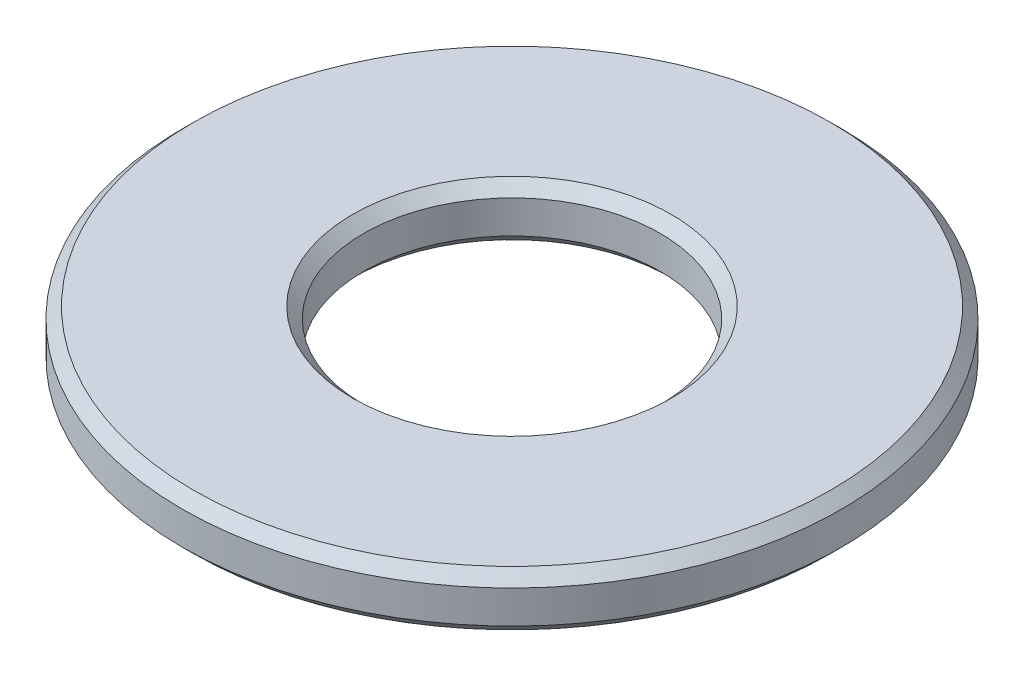
ISO-10303-21;
HEADER;
FILE_DESCRIPTION(('STEP AP214'),'2;1');
FILE_NAME('part.step','',(''),(''),'','','');
FILE_SCHEMA(('AUTOMOTIVE_DESIGN { 1 0 10303 214 1 1 1 1 }'));
ENDSEC;
DATA;
#1=APPLICATION_CONTEXT('core data for automotive mechanical design processes');
#2=APPLICATION_PROTOCOL_DEFINITION('international standard','automotive_design',2000,#1);
#3=PRODUCT_CONTEXT('',#1,'mechanical');
#4=PRODUCT('Part','Part','',(#3));
#5=PRODUCT_RELATED_PRODUCT_CATEGORY('part','',(#4));
#6=PRODUCT_DEFINITION_FORMATION('','',#4);
#7=PRODUCT_DEFINITION_CONTEXT('part definition',#1,'design');
#8=PRODUCT_DEFINITION('design','',#6,#7);
#9=PRODUCT_DEFINITION_SHAPE('','',#8);
#10=(LENGTH_UNIT() NAMED_UNIT(*) SI_UNIT(.MILLI.,.METRE.));
#11=(NAMED_UNIT(*) PLANE_ANGLE_UNIT() SI_UNIT($,.RADIAN.));
#12=(NAMED_UNIT(*) SI_UNIT($,.STERADIAN.) SOLID_ANGLE_UNIT());
#13=UNCERTAINTY_MEASURE_WITH_UNIT(LENGTH_MEASURE(1.E-05),#10,'distance_accuracy_value','');
#14=(GEOMETRIC_REPRESENTATION_CONTEXT(3) GLOBAL_UNCERTAINTY_ASSIGNED_CONTEXT((#13)) GLOBAL_UNIT_ASSIGNED_CONTEXT((#10,
#11,#12)) REPRESENTATION_CONTEXT('',''));
#15=CARTESIAN_POINT('',(0.,0.,0.));
#16=DIRECTION('',(0.,0.,1.));
#17=DIRECTION('',(1.,0.,0.));
#18=AXIS2_PLACEMENT_3D('',#15,#16,#17);
#19=CARTESIAN_POINT('',(0.,0.5,0.));
#20=DIRECTION('',(0.,1.,0.));
#21=DIRECTION('',(0.,0.,1.));
#22=AXIS2_PLACEMENT_3D('',#19,#20,#21);
#23=PLANE('',#22);
#24=CARTESIAN_POINT('',(0.,0.5,0.));
#25=DIRECTION('',(0.,1.,0.));
#26=DIRECTION('',(0.,0.,1.));
#27=AXIS2_PLACEMENT_3D('',#24,#25,#26);
#28=CIRCLE('',#27,2.9);
#29=CARTESIAN_POINT('',(0.,0.5,2.9));
#30=VERTEX_POINT('',#29);
#31=EDGE_CURVE('E10',#30,#30,#28,.T.);
#32=ORIENTED_EDGE('',*,*,#31,.T.);
#33=EDGE_LOOP('',(#32));
#34=FACE_BOUND('',#33,.T.);
#35=CARTESIAN_POINT('',(0.,0.5,0.));
#36=DIRECTION('',(0.,1.,0.));
#37=DIRECTION('',(0.,0.,1.));
#38=AXIS2_PLACEMENT_3D('',#35,#36,#37);
#39=CIRCLE('',#38,1.45);
#40=CARTESIAN_POINT('',(0.,0.5,1.45));
#41=VERTEX_POINT('',#40);
#42=EDGE_CURVE('E47',#41,#41,#39,.F.);
#43=ORIENTED_EDGE('',*,*,#42,.T.);
#44=EDGE_LOOP('',(#43));
#45=FACE_BOUND('',#44,.T.);
#46=ADVANCED_FACE('F39',(#34,#45),#23,.T.);
#47=CARTESIAN_POINT('',(0.,0.,0.));
#48=DIRECTION('',(0.,1.,0.));
#49=DIRECTION('',(0.,0.,1.));
#50=AXIS2_PLACEMENT_3D('',#47,#48,#49);
#51=PLANE('',#50);
#52=CARTESIAN_POINT('',(0.,0.,0.));
#53=DIRECTION('',(0.,1.,0.));
#54=DIRECTION('',(0.,0.,1.));
#55=AXIS2_PLACEMENT_3D('',#52,#53,#54);
#56=CIRCLE('',#55,1.45);
#57=CARTESIAN_POINT('',(0.,0.,1.45));
#58=VERTEX_POINT('',#57);
#59=EDGE_CURVE('E66',#58,#58,#56,.T.);
#60=ORIENTED_EDGE('',*,*,#59,.T.);
#61=EDGE_LOOP('',(#60));
#62=FACE_BOUND('',#61,.T.);
#63=CARTESIAN_POINT('',(0.,0.,0.));
#64=DIRECTION('',(0.,1.,0.));
#65=DIRECTION('',(0.,0.,1.));
#66=AXIS2_PLACEMENT_3D('',#63,#64,#65);
#67=CIRCLE('',#66,2.9);
#68=CARTESIAN_POINT('',(0.,0.,2.9));
#69=VERTEX_POINT('',#68);
#70=EDGE_CURVE('E69',#69,#69,#67,.F.);
#71=ORIENTED_EDGE('',*,*,#70,.T.);
#72=EDGE_LOOP('',(#71));
#73=FACE_BOUND('',#72,.T.);
#74=ADVANCED_FACE('F73',(#62,#73),#51,.F.);
#75=CARTESIAN_POINT('',(0.,0.5,0.));
#76=DIRECTION('',(0.,-1.,0.));
#77=DIRECTION('',(0.,0.,-1.));
#78=AXIS2_PLACEMENT_3D('',#75,#76,#77);
#79=CYLINDRICAL_SURFACE('',#78,3.);
#80=CARTESIAN_POINT('',(0.,0.0999999999999985,0.));
#81=DIRECTION('',(0.,1.,0.));
#82=DIRECTION('',(0.,0.,1.));
#83=AXIS2_PLACEMENT_3D('',#80,#81,#82);
#84=CIRCLE('',#83,3.);
#85=CARTESIAN_POINT('',(0.,0.0999999999999985,3.));
#86=VERTEX_POINT('',#85);
#87=EDGE_CURVE('E51',#86,#86,#84,.T.);
#88=ORIENTED_EDGE('',*,*,#87,.T.);
#89=EDGE_LOOP('',(#88));
#90=FACE_BOUND('',#89,.T.);
#91=CARTESIAN_POINT('',(0.,0.400000000000001,0.));
#92=DIRECTION('',(0.,1.,0.));
#93=DIRECTION('',(0.,0.,1.));
#94=AXIS2_PLACEMENT_3D('',#91,#92,#93);
#95=CIRCLE('',#94,3.);
#96=CARTESIAN_POINT('',(0.,0.400000000000001,3.));
#97=VERTEX_POINT('',#96);
#98=EDGE_CURVE('E55',#97,#97,#95,.F.);
#99=ORIENTED_EDGE('',*,*,#98,.T.);
#100=EDGE_LOOP('',(#99));
#101=FACE_BOUND('',#100,.T.);
#102=ADVANCED_FACE('F83',(#90,#101),#79,.T.);
#103=CARTESIAN_POINT('',(0.,0.5,0.));
#104=DIRECTION('',(0.,-1.,0.));
#105=DIRECTION('',(0.,0.,-1.));
#106=AXIS2_PLACEMENT_3D('',#103,#104,#105);
#107=CYLINDRICAL_SURFACE('',#106,1.35);
#108=CARTESIAN_POINT('',(0.,0.100000000000001,0.));
#109=DIRECTION('',(0.,1.,0.));
#110=DIRECTION('',(0.,0.,1.));
#111=AXIS2_PLACEMENT_3D('',#108,#109,#110);
#112=CIRCLE('',#111,1.35);
#113=CARTESIAN_POINT('',(0.,0.100000000000001,1.35));
#114=VERTEX_POINT('',#113);
#115=EDGE_CURVE('E60',#114,#114,#112,.F.);
#116=ORIENTED_EDGE('',*,*,#115,.T.);
#117=EDGE_LOOP('',(#116));
#118=FACE_BOUND('',#117,.T.);
#119=CARTESIAN_POINT('',(0.,0.400000000000003,0.));
#120=DIRECTION('',(0.,1.,0.));
#121=DIRECTION('',(0.,0.,1.));
#122=AXIS2_PLACEMENT_3D('',#119,#120,#121);
#123=CIRCLE('',#122,1.35);
#124=CARTESIAN_POINT('',(0.,0.400000000000003,1.35));
#125=VERTEX_POINT('',#124);
#126=EDGE_CURVE('E63',#125,#125,#123,.T.);
#127=ORIENTED_EDGE('',*,*,#126,.T.);
#128=EDGE_LOOP('',(#127));
#129=FACE_BOUND('',#128,.T.);
#130=ADVANCED_FACE('F86',(#118,#129),#107,.F.);
#131=CARTESIAN_POINT('',(0.,0.,0.));
#132=DIRECTION('',(0.,-1.,0.));
#133=DIRECTION('',(0.,0.,-1.));
#134=AXIS2_PLACEMENT_3D('',#131,#132,#133);
#135=CONICAL_SURFACE('',#134,1.45,0.785398163397442);
#136=ORIENTED_EDGE('',*,*,#115,.F.);
#137=EDGE_LOOP('',(#136));
#138=FACE_BOUND('',#137,.T.);
#139=ORIENTED_EDGE('',*,*,#59,.F.);
#140=EDGE_LOOP('',(#139));
#141=FACE_BOUND('',#140,.T.);
#142=ADVANCED_FACE('F79',(#138,#141),#135,.F.);
#143=CARTESIAN_POINT('',(0.,0.0999999999999985,0.));
#144=DIRECTION('',(0.,1.,0.));
#145=DIRECTION('',(0.,0.,1.));
#146=AXIS2_PLACEMENT_3D('',#143,#144,#145);
#147=CONICAL_SURFACE('',#146,3.,0.785398163397448);
#148=ORIENTED_EDGE('',*,*,#70,.F.);
#149=EDGE_LOOP('',(#148));
#150=FACE_BOUND('',#149,.T.);
#151=ORIENTED_EDGE('',*,*,#87,.F.);
#152=EDGE_LOOP('',(#151));
#153=FACE_BOUND('',#152,.T.);
#154=ADVANCED_FACE('F75',(#150,#153),#147,.T.);
#155=CARTESIAN_POINT('',(0.,0.5,0.));
#156=DIRECTION('',(0.,-1.,0.));
#157=DIRECTION('',(0.,0.,-1.));
#158=AXIS2_PLACEMENT_3D('',#155,#156,#157);
#159=CONICAL_SURFACE('',#158,2.9,0.78539816339744);
#160=ORIENTED_EDGE('',*,*,#98,.F.);
#161=EDGE_LOOP('',(#160));
#162=FACE_BOUND('',#161,.T.);
#163=ORIENTED_EDGE('',*,*,#31,.F.);
#164=EDGE_LOOP('',(#163));
#165=FACE_BOUND('',#164,.T.);
#166=ADVANCED_FACE('F78',(#162,#165),#159,.T.);
#167=CARTESIAN_POINT('',(0.,0.400000000000003,0.));
#168=DIRECTION('',(0.,1.,0.));
#169=DIRECTION('',(0.,0.,1.));
#170=AXIS2_PLACEMENT_3D('',#167,#168,#169);
#171=CONICAL_SURFACE('',#170,1.35,0.785398163397452);
#172=ORIENTED_EDGE('',*,*,#42,.F.);
#173=EDGE_LOOP('',(#172));
#174=FACE_BOUND('',#173,.T.);
#175=ORIENTED_EDGE('',*,*,#126,.F.);
#176=EDGE_LOOP('',(#175));
#177=FACE_BOUND('',#176,.T.);
#178=ADVANCED_FACE('F42',(#174,#177),#171,.F.);
#179=CLOSED_SHELL('',(#46,#74,#102,#130,#142,#154,#166,#178));
#180=MANIFOLD_SOLID_BREP('B2',#179);
#181=ADVANCED_BREP_SHAPE_REPRESENTATION('',(#18,#180),#14);
#182=SHAPE_DEFINITION_REPRESENTATION(#9,#181);
ENDSEC;
END-ISO-10303-21;
